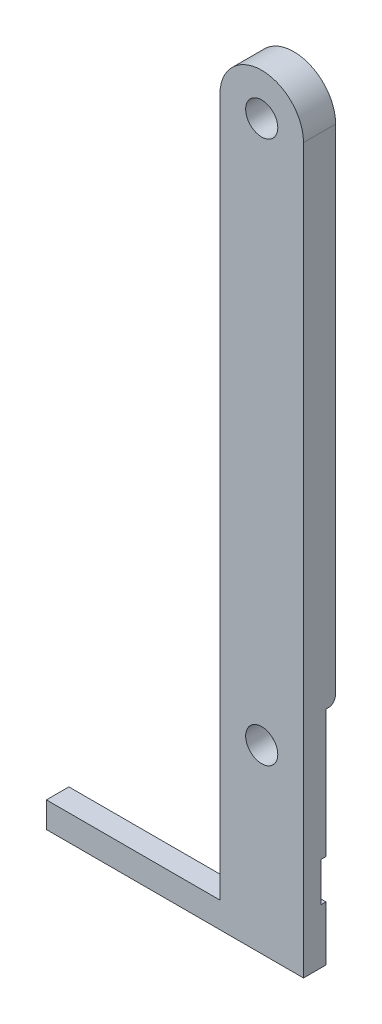
ISO-10303-21;
HEADER;
FILE_DESCRIPTION(('STEP AP214'),'2;1');
FILE_NAME('part.step','',(''),(''),'','','');
FILE_SCHEMA(('AUTOMOTIVE_DESIGN { 1 0 10303 214 1 1 1 1 }'));
ENDSEC;
DATA;
#1=APPLICATION_CONTEXT('core data for automotive mechanical design processes');
#2=APPLICATION_PROTOCOL_DEFINITION('international standard','automotive_design',2000,#1);
#3=PRODUCT_CONTEXT('',#1,'mechanical');
#4=PRODUCT('Part','Part','',(#3));
#5=PRODUCT_RELATED_PRODUCT_CATEGORY('part','',(#4));
#6=PRODUCT_DEFINITION_FORMATION('','',#4);
#7=PRODUCT_DEFINITION_CONTEXT('part definition',#1,'design');
#8=PRODUCT_DEFINITION('design','',#6,#7);
#9=PRODUCT_DEFINITION_SHAPE('','',#8);
#10=(LENGTH_UNIT() NAMED_UNIT(*) SI_UNIT(.MILLI.,.METRE.));
#11=(NAMED_UNIT(*) PLANE_ANGLE_UNIT() SI_UNIT($,.RADIAN.));
#12=(NAMED_UNIT(*) SI_UNIT($,.STERADIAN.) SOLID_ANGLE_UNIT());
#13=UNCERTAINTY_MEASURE_WITH_UNIT(LENGTH_MEASURE(1.E-05),#10,'distance_accuracy_value','');
#14=(GEOMETRIC_REPRESENTATION_CONTEXT(3) GLOBAL_UNCERTAINTY_ASSIGNED_CONTEXT((#13)) GLOBAL_UNIT_ASSIGNED_CONTEXT((#10,
#11,#12)) REPRESENTATION_CONTEXT('',''));
#15=CARTESIAN_POINT('',(0.,0.,0.));
#16=DIRECTION('',(0.,0.,1.));
#17=DIRECTION('',(1.,0.,0.));
#18=AXIS2_PLACEMENT_3D('',#15,#16,#17);
#19=CARTESIAN_POINT('',(0.,-24.12,5.));
#20=DIRECTION('',(0.,-1.,0.));
#21=DIRECTION('',(1.,0.,0.));
#22=AXIS2_PLACEMENT_3D('',#19,#20,#21);
#23=PLANE('',#22);
#24=DIRECTION('',(1.,0.,0.));
#25=VECTOR('',#24,1.);
#26=CARTESIAN_POINT('',(0.,-24.12,1.5));
#27=LINE('',#26,#25);
#28=CARTESIAN_POINT('',(-33.5,-24.12,1.5));
#29=VERTEX_POINT('',#28);
#30=CARTESIAN_POINT('',(-6.49999999999999,-24.12,1.5));
#31=VERTEX_POINT('',#30);
#32=EDGE_CURVE('E228',#29,#31,#27,.T.);
#33=ORIENTED_EDGE('',*,*,#32,.F.);
#34=DIRECTION('',(0.,0.,-1.));
#35=VECTOR('',#34,1.);
#36=CARTESIAN_POINT('',(-33.5,-24.12,5.));
#37=LINE('',#36,#35);
#38=CARTESIAN_POINT('',(-33.5,-24.12,5.));
#39=VERTEX_POINT('',#38);
#40=EDGE_CURVE('E283',#39,#29,#37,.T.);
#41=ORIENTED_EDGE('',*,*,#40,.F.);
#42=DIRECTION('',(-1.,0.,0.));
#43=VECTOR('',#42,1.);
#44=CARTESIAN_POINT('',(0.,-24.12,5.));
#45=LINE('',#44,#43);
#46=CARTESIAN_POINT('',(-6.49999999999999,-24.12,5.));
#47=VERTEX_POINT('',#46);
#48=EDGE_CURVE('E237',#47,#39,#45,.T.);
#49=ORIENTED_EDGE('',*,*,#48,.F.);
#50=DIRECTION('',(0.,0.,-1.));
#51=VECTOR('',#50,1.);
#52=CARTESIAN_POINT('',(-6.49999999999999,-24.12,5.));
#53=LINE('',#52,#51);
#54=EDGE_CURVE('E261',#47,#31,#53,.T.);
#55=ORIENTED_EDGE('',*,*,#54,.T.);
#56=EDGE_LOOP('',(#33,#41,#49,#55));
#57=FACE_BOUND('',#56,.T.);
#58=ADVANCED_FACE('F41',(#57),#23,.F.);
#59=CARTESIAN_POINT('',(-33.5,0.,5.));
#60=DIRECTION('',(1.,0.,0.));
#61=DIRECTION('',(0.,0.,-1.));
#62=AXIS2_PLACEMENT_3D('',#59,#60,#61);
#63=PLANE('',#62);
#64=DIRECTION('',(0.,1.,0.));
#65=VECTOR('',#64,1.);
#66=CARTESIAN_POINT('',(-33.5,0.,1.5));
#67=LINE('',#66,#65);
#68=CARTESIAN_POINT('',(-33.5,-28.12,1.5));
#69=VERTEX_POINT('',#68);
#70=EDGE_CURVE('E226',#69,#29,#67,.T.);
#71=ORIENTED_EDGE('',*,*,#70,.F.);
#72=DIRECTION('',(0.,0.,-1.));
#73=VECTOR('',#72,1.);
#74=CARTESIAN_POINT('',(-33.5,-28.12,5.));
#75=LINE('',#74,#73);
#76=CARTESIAN_POINT('',(-33.5,-28.12,5.));
#77=VERTEX_POINT('',#76);
#78=EDGE_CURVE('E280',#77,#69,#75,.T.);
#79=ORIENTED_EDGE('',*,*,#78,.F.);
#80=DIRECTION('',(0.,-1.,0.));
#81=VECTOR('',#80,1.);
#82=CARTESIAN_POINT('',(-33.5,0.,5.));
#83=LINE('',#82,#81);
#84=EDGE_CURVE('E240',#39,#77,#83,.T.);
#85=ORIENTED_EDGE('',*,*,#84,.F.);
#86=ORIENTED_EDGE('',*,*,#40,.T.);
#87=EDGE_LOOP('',(#71,#79,#85,#86));
#88=FACE_BOUND('',#87,.T.);
#89=ADVANCED_FACE('F305',(#88),#63,.F.);
#90=CARTESIAN_POINT('',(0.,-28.12,5.));
#91=DIRECTION('',(0.,-1.,0.));
#92=DIRECTION('',(0.,0.,-1.));
#93=AXIS2_PLACEMENT_3D('',#90,#91,#92);
#94=PLANE('',#93);
#95=ORIENTED_EDGE('',*,*,#78,.T.);
#96=DIRECTION('',(-1.,0.,0.));
#97=VECTOR('',#96,1.);
#98=CARTESIAN_POINT('',(0.,-28.12,1.5));
#99=LINE('',#98,#97);
#100=CARTESIAN_POINT('',(6.50000000000001,-28.12,1.5));
#101=VERTEX_POINT('',#100);
#102=EDGE_CURVE('E224',#101,#69,#99,.T.);
#103=ORIENTED_EDGE('',*,*,#102,.F.);
#104=DIRECTION('',(0.,0.,-1.));
#105=VECTOR('',#104,1.);
#106=CARTESIAN_POINT('',(6.50000000000001,-28.12,5.));
#107=LINE('',#106,#105);
#108=CARTESIAN_POINT('',(6.50000000000001,-28.12,5.));
#109=VERTEX_POINT('',#108);
#110=EDGE_CURVE('E277',#109,#101,#107,.T.);
#111=ORIENTED_EDGE('',*,*,#110,.F.);
#112=DIRECTION('',(-1.,0.,0.));
#113=VECTOR('',#112,1.);
#114=CARTESIAN_POINT('',(0.,-28.12,5.));
#115=LINE('',#114,#113);
#116=EDGE_CURVE('E243',#109,#77,#115,.T.);
#117=ORIENTED_EDGE('',*,*,#116,.T.);
#118=EDGE_LOOP('',(#95,#103,#111,#117));
#119=FACE_BOUND('',#118,.T.);
#120=ADVANCED_FACE('F302',(#119),#94,.T.);
#121=CARTESIAN_POINT('',(0.,0.,5.));
#122=DIRECTION('',(0.,0.,-1.));
#123=DIRECTION('',(-1.,0.,0.));
#124=AXIS2_PLACEMENT_3D('',#121,#122,#123);
#125=CYLINDRICAL_SURFACE('',#124,2.5);
#126=CARTESIAN_POINT('',(0.,0.,5.));
#127=DIRECTION('',(0.,0.,1.));
#128=DIRECTION('',(1.,0.,0.));
#129=AXIS2_PLACEMENT_3D('',#126,#127,#128);
#130=CIRCLE('',#129,2.5);
#131=CARTESIAN_POINT('',(2.50000000000001,0.,5.));
#132=VERTEX_POINT('',#131);
#133=EDGE_CURVE('E254',#132,#132,#130,.T.);
#134=ORIENTED_EDGE('',*,*,#133,.T.);
#135=EDGE_LOOP('',(#134));
#136=FACE_BOUND('',#135,.T.);
#137=CARTESIAN_POINT('',(0.,0.,1.5));
#138=DIRECTION('',(0.,0.,-1.));
#139=DIRECTION('',(-1.,0.,0.));
#140=AXIS2_PLACEMENT_3D('',#137,#138,#139);
#141=CIRCLE('',#140,2.5);
#142=CARTESIAN_POINT('',(-2.49999999999999,0.,1.5));
#143=VERTEX_POINT('',#142);
#144=EDGE_CURVE('E194',#143,#143,#141,.F.);
#145=ORIENTED_EDGE('',*,*,#144,.F.);
#146=EDGE_LOOP('',(#145));
#147=FACE_BOUND('',#146,.T.);
#148=ADVANCED_FACE('F301',(#136,#147),#125,.F.);
#149=CARTESIAN_POINT('',(6.50000000000001,0.,5.));
#150=DIRECTION('',(1.,0.,0.));
#151=DIRECTION('',(0.,1.,0.));
#152=AXIS2_PLACEMENT_3D('',#149,#150,#151);
#153=PLANE('',#152);
#154=DIRECTION('',(0.,0.,-1.));
#155=VECTOR('',#154,1.);
#156=CARTESIAN_POINT('',(6.50000000000001,6.36867333123626,1.5));
#157=LINE('',#156,#155);
#158=CARTESIAN_POINT('',(6.50000000000001,6.36867333123626,1.5));
#159=VERTEX_POINT('',#158);
#160=CARTESIAN_POINT('',(6.50000000000001,6.36867333123626,1.));
#161=VERTEX_POINT('',#160);
#162=EDGE_CURVE('E231',#159,#161,#157,.T.);
#163=ORIENTED_EDGE('',*,*,#162,.T.);
#164=CARTESIAN_POINT('',(6.50000000000001,6.36867333123626,1.));
#165=CARTESIAN_POINT('',(6.50000000000001,6.36866820237821,0.977485770303179));
#166=CARTESIAN_POINT('',(6.50000000000001,6.36976071423195,0.954985972087633));
#167=CARTESIAN_POINT('',(6.50000000000001,6.37408363522691,0.91021262475121));
#168=CARTESIAN_POINT('',(6.50000000000001,6.37731211087929,0.887938889493821));
#169=CARTESIAN_POINT('',(6.50000000000001,6.39003212132548,0.822138456041034));
#170=CARTESIAN_POINT('',(6.50000000000001,6.40256084251514,0.779169784210516));
#171=CARTESIAN_POINT('',(6.50000000000001,6.43466204370983,0.696190380620716));
#172=CARTESIAN_POINT('',(6.50000000000001,6.45421149166794,0.65617048659475));
#173=CARTESIAN_POINT('',(6.50000000000001,6.49914525862485,0.579469523882496));
#174=CARTESIAN_POINT('',(6.50000000000001,6.52454431350942,0.542797219598954));
#175=CARTESIAN_POINT('',(6.50000000000001,6.59220313531779,0.45780477912176));
#176=CARTESIAN_POINT('',(6.50000000000001,6.63696023016391,0.411474829333932));
#177=CARTESIAN_POINT('',(6.50000000000001,6.73328003540041,0.326550820519542));
#178=CARTESIAN_POINT('',(6.50000000000001,6.7848560627837,0.287972280906358));
#179=CARTESIAN_POINT('',(6.50000000000001,6.91146310029313,0.206263960610442));
#180=CARTESIAN_POINT('',(6.50000000000001,6.98844490488129,0.166160062876906));
#181=CARTESIAN_POINT('',(6.50000000000001,7.14783748096019,0.0988753340111897));
#182=CARTESIAN_POINT('',(6.50000000000001,7.23025356232351,0.0717073622536575));
#183=CARTESIAN_POINT('',(6.50000000000001,7.38238026527006,0.0339757639807743));
#184=CARTESIAN_POINT('',(6.50000000000001,7.45156546553959,0.0212503493596623));
#185=CARTESIAN_POINT('',(6.50000000000001,7.59065100826131,0.00429641915157164));
#186=CARTESIAN_POINT('',(6.50000000000001,7.66054668414649,2.962860249586E-05));
#187=CARTESIAN_POINT('',(6.50000000000001,7.73045923603508,0.));
#188=B_SPLINE_CURVE_WITH_KNOTS('',3,(#164,#165,#166,#167,#168,#169,#170,#171,#172,#173,#174,
#175,#176,#177,#178,#179,#180,#181,#182,#183,#184,#185,#186,#187),.UNSPECIFIED.,.F.,.F.,(4,2,2,
2,2,2,2,2,2,2,2,4),(0.,0.0674891147470087,0.134917221325395,0.26840751606408,0.401463826904855,
0.534859062110028,0.72704815602951,0.919618287130857,1.17866219132704,1.43796307161406,
1.64849931101882,1.85808068722376),.UNSPECIFIED.);
#189=CARTESIAN_POINT('',(6.50000000000001,7.73045923603508,0.));
#190=VERTEX_POINT('',#189);
#191=EDGE_CURVE('E73',#161,#190,#188,.T.);
#192=ORIENTED_EDGE('',*,*,#191,.T.);
#193=DIRECTION('',(0.,-1.,0.));
#194=VECTOR('',#193,1.);
#195=CARTESIAN_POINT('',(6.50000000000001,0.,0.));
#196=LINE('',#195,#194);
#197=CARTESIAN_POINT('',(6.50000000000002,84.43,0.));
#198=VERTEX_POINT('',#197);
#199=EDGE_CURVE('E233',#198,#190,#196,.T.);
#200=ORIENTED_EDGE('',*,*,#199,.F.);
#201=DIRECTION('',(0.,0.,-1.));
#202=VECTOR('',#201,1.);
#203=CARTESIAN_POINT('',(6.50000000000002,84.43,5.));
#204=LINE('',#203,#202);
#205=CARTESIAN_POINT('',(6.50000000000002,84.43,5.));
#206=VERTEX_POINT('',#205);
#207=EDGE_CURVE('E275',#206,#198,#204,.T.);
#208=ORIENTED_EDGE('',*,*,#207,.F.);
#209=DIRECTION('',(0.,-1.,0.));
#210=VECTOR('',#209,1.);
#211=CARTESIAN_POINT('',(6.50000000000001,0.,5.));
#212=LINE('',#211,#210);
#213=EDGE_CURVE('E246',#206,#109,#212,.T.);
#214=ORIENTED_EDGE('',*,*,#213,.T.);
#215=ORIENTED_EDGE('',*,*,#110,.T.);
#216=DIRECTION('',(0.,-1.,0.));
#217=VECTOR('',#216,1.);
#218=CARTESIAN_POINT('',(6.50000000000001,0.,1.5));
#219=LINE('',#218,#217);
#220=CARTESIAN_POINT('',(6.50000000000001,-19.61,1.5));
#221=VERTEX_POINT('',#220);
#222=EDGE_CURVE('E220',#221,#101,#219,.T.);
#223=ORIENTED_EDGE('',*,*,#222,.F.);
#224=DIRECTION('',(0.,0.,-1.));
#225=VECTOR('',#224,1.);
#226=CARTESIAN_POINT('',(6.50000000000001,-19.61,2.3));
#227=LINE('',#226,#225);
#228=CARTESIAN_POINT('',(6.50000000000001,-19.61,2.3));
#229=VERTEX_POINT('',#228);
#230=EDGE_CURVE('E195',#229,#221,#227,.T.);
#231=ORIENTED_EDGE('',*,*,#230,.F.);
#232=DIRECTION('',(0.,-1.,0.));
#233=VECTOR('',#232,1.);
#234=CARTESIAN_POINT('',(6.50000000000001,0.,2.3));
#235=LINE('',#234,#233);
#236=CARTESIAN_POINT('',(6.50000000000001,-13.51,2.3));
#237=VERTEX_POINT('',#236);
#238=EDGE_CURVE('E177',#237,#229,#235,.T.);
#239=ORIENTED_EDGE('',*,*,#238,.F.);
#240=DIRECTION('',(0.,0.,-1.));
#241=VECTOR('',#240,1.);
#242=CARTESIAN_POINT('',(6.50000000000001,-13.51,2.3));
#243=LINE('',#242,#241);
#244=CARTESIAN_POINT('',(6.50000000000001,-13.51,1.5));
#245=VERTEX_POINT('',#244);
#246=EDGE_CURVE('E168',#237,#245,#243,.T.);
#247=ORIENTED_EDGE('',*,*,#246,.T.);
#248=EDGE_CURVE('E221',#159,#245,#219,.T.);
#249=ORIENTED_EDGE('',*,*,#248,.F.);
#250=EDGE_LOOP('',(#163,#192,#200,#208,#214,#215,#223,#231,#239,#247,#249));
#251=FACE_BOUND('',#250,.T.);
#252=ADVANCED_FACE('F295',(#251),#153,.T.);
#253=CARTESIAN_POINT('',(0.,84.43,5.));
#254=DIRECTION('',(0.,0.,-1.));
#255=DIRECTION('',(-1.,0.,0.));
#256=AXIS2_PLACEMENT_3D('',#253,#254,#255);
#257=CYLINDRICAL_SURFACE('',#256,6.5);
#258=CARTESIAN_POINT('',(0.,84.43,0.));
#259=DIRECTION('',(0.,0.,1.));
#260=DIRECTION('',(1.,0.,0.));
#261=AXIS2_PLACEMENT_3D('',#258,#259,#260);
#262=CIRCLE('',#261,6.5);
#263=CARTESIAN_POINT('',(-6.49999999999999,84.43,0.));
#264=VERTEX_POINT('',#263);
#265=EDGE_CURVE('E263',#198,#264,#262,.T.);
#266=ORIENTED_EDGE('',*,*,#265,.T.);
#267=DIRECTION('',(0.,0.,-1.));
#268=VECTOR('',#267,1.);
#269=CARTESIAN_POINT('',(-6.49999999999999,84.43,5.));
#270=LINE('',#269,#268);
#271=CARTESIAN_POINT('',(-6.49999999999999,84.43,5.));
#272=VERTEX_POINT('',#271);
#273=EDGE_CURVE('E272',#272,#264,#270,.T.);
#274=ORIENTED_EDGE('',*,*,#273,.F.);
#275=CARTESIAN_POINT('',(0.,84.43,5.));
#276=DIRECTION('',(0.,0.,1.));
#277=DIRECTION('',(1.,0.,0.));
#278=AXIS2_PLACEMENT_3D('',#275,#276,#277);
#279=CIRCLE('',#278,6.5);
#280=EDGE_CURVE('E249',#206,#272,#279,.T.);
#281=ORIENTED_EDGE('',*,*,#280,.F.);
#282=ORIENTED_EDGE('',*,*,#207,.T.);
#283=EDGE_LOOP('',(#266,#274,#281,#282));
#284=FACE_BOUND('',#283,.T.);
#285=ADVANCED_FACE('F300',(#284),#257,.T.);
#286=CARTESIAN_POINT('',(-6.49999999999999,0.,5.));
#287=DIRECTION('',(1.,0.,0.));
#288=DIRECTION('',(0.,1.,0.));
#289=AXIS2_PLACEMENT_3D('',#286,#287,#288);
#290=PLANE('',#289);
#291=DIRECTION('',(0.,-1.,0.));
#292=VECTOR('',#291,1.);
#293=CARTESIAN_POINT('',(-6.49999999999999,0.,0.));
#294=LINE('',#293,#292);
#295=CARTESIAN_POINT('',(-6.49999999999999,7.73045923603508,0.));
#296=VERTEX_POINT('',#295);
#297=EDGE_CURVE('E265',#264,#296,#294,.T.);
#298=ORIENTED_EDGE('',*,*,#297,.T.);
#299=CARTESIAN_POINT('',(-6.49999999999999,7.73045923603508,0.));
#300=CARTESIAN_POINT('',(-6.49999999999999,7.68841108720236,4.89197177850845E-06));
#301=CARTESIAN_POINT('',(-6.49999999999999,7.64638002589235,0.00155375181801104));
#302=CARTESIAN_POINT('',(-6.49999999999999,7.56254100373806,0.00770476620955288));
#303=CARTESIAN_POINT('',(-6.49999999999999,7.5207330463868,0.0123069684186861));
#304=CARTESIAN_POINT('',(-6.49999999999999,7.39506342378203,0.0307687408217459));
#305=CARTESIAN_POINT('',(-6.49999999999999,7.31183907855206,0.049282585772636));
#306=CARTESIAN_POINT('',(-6.49999999999999,7.13703188289832,0.102241890412782));
#307=CARTESIAN_POINT('',(-6.49999999999999,7.04603557868287,0.13864012482835));
#308=CARTESIAN_POINT('',(-6.49999999999999,6.87286064417869,0.228139463694193));
#309=CARTESIAN_POINT('',(-6.49999999999999,6.79064138792755,0.28115870153319));
#310=CARTESIAN_POINT('',(-6.49999999999999,6.67355964380147,0.377691068655086));
#311=CARTESIAN_POINT('',(-6.49999999999999,6.63372222562028,0.415205345047863));
#312=CARTESIAN_POINT('',(-6.49999999999999,6.56021262020435,0.495889721803572));
#313=CARTESIAN_POINT('',(-6.49999999999999,6.52653243148407,0.539052354926632));
#314=CARTESIAN_POINT('',(-6.49999999999999,6.4727722862949,0.622341301560378));
#315=CARTESIAN_POINT('',(-6.49999999999999,6.45133220606839,0.661585688539413));
#316=CARTESIAN_POINT('',(-6.49999999999999,6.41523690262441,0.743050465484703));
#317=CARTESIAN_POINT('',(-6.49999999999999,6.40056656093085,0.785263979109133));
#318=CARTESIAN_POINT('',(-6.49999999999999,6.38288435332132,0.856439466267798));
#319=CARTESIAN_POINT('',(-6.49999999999999,6.37758724145912,0.884845665806041));
#320=CARTESIAN_POINT('',(-6.49999999999999,6.37046783718241,0.942158395066292));
#321=CARTESIAN_POINT('',(-6.49999999999999,6.36865406784237,0.971065977815371));
#322=CARTESIAN_POINT('',(-6.49999999999999,6.36867333123626,0.999999999999999));
#323=B_SPLINE_CURVE_WITH_KNOTS('',3,(#299,#300,#301,#302,#303,#304,#305,#306,#307,#308,#309,
#310,#311,#312,#313,#314,#315,#316,#317,#318,#319,#320,#321,#322),.UNSPECIFIED.,.F.,.F.,(4,2,2,
2,2,2,2,2,2,2,2,4),(0.,0.126083405385702,0.252168779027143,0.506963525585729,0.799478207696993,
1.09057416763202,1.25424021235184,1.4176920328308,1.55133357518331,1.68467520155345,
1.77116254792582,1.85786124405855),.UNSPECIFIED.);
#324=CARTESIAN_POINT('',(-6.49999999999999,6.36867333123626,1.));
#325=VERTEX_POINT('',#324);
#326=EDGE_CURVE('E11',#296,#325,#323,.T.);
#327=ORIENTED_EDGE('',*,*,#326,.T.);
#328=DIRECTION('',(0.,0.,-1.));
#329=VECTOR('',#328,1.);
#330=CARTESIAN_POINT('',(-6.49999999999999,6.36867333123626,1.5));
#331=LINE('',#330,#329);
#332=CARTESIAN_POINT('',(-6.49999999999999,6.36867333123626,1.5));
#333=VERTEX_POINT('',#332);
#334=EDGE_CURVE('E230',#333,#325,#331,.T.);
#335=ORIENTED_EDGE('',*,*,#334,.F.);
#336=DIRECTION('',(0.,1.,0.));
#337=VECTOR('',#336,1.);
#338=CARTESIAN_POINT('',(-6.49999999999999,0.,1.5));
#339=LINE('',#338,#337);
#340=CARTESIAN_POINT('',(-6.49999999999999,-15.7300389275978,1.5));
#341=VERTEX_POINT('',#340);
#342=EDGE_CURVE('E212',#341,#333,#339,.T.);
#343=ORIENTED_EDGE('',*,*,#342,.F.);
#344=DIRECTION('',(0.,0.,-1.));
#345=VECTOR('',#344,1.);
#346=CARTESIAN_POINT('',(-6.49999999999999,-15.7300389275978,2.3));
#347=LINE('',#346,#345);
#348=CARTESIAN_POINT('',(-6.49999999999999,-15.7300389275978,2.3));
#349=VERTEX_POINT('',#348);
#350=EDGE_CURVE('E204',#349,#341,#347,.T.);
#351=ORIENTED_EDGE('',*,*,#350,.F.);
#352=DIRECTION('',(0.,1.,0.));
#353=VECTOR('',#352,1.);
#354=CARTESIAN_POINT('',(-6.49999999999999,0.,2.3));
#355=LINE('',#354,#353);
#356=CARTESIAN_POINT('',(-6.49999999999999,-21.5099610724022,2.3));
#357=VERTEX_POINT('',#356);
#358=EDGE_CURVE('E198',#357,#349,#355,.T.);
#359=ORIENTED_EDGE('',*,*,#358,.F.);
#360=DIRECTION('',(0.,0.,-1.));
#361=VECTOR('',#360,1.);
#362=CARTESIAN_POINT('',(-6.49999999999999,-21.5099610724022,2.3));
#363=LINE('',#362,#361);
#364=CARTESIAN_POINT('',(-6.49999999999999,-21.5099610724022,1.5));
#365=VERTEX_POINT('',#364);
#366=EDGE_CURVE('E190',#357,#365,#363,.T.);
#367=ORIENTED_EDGE('',*,*,#366,.T.);
#368=EDGE_CURVE('E213',#31,#365,#339,.T.);
#369=ORIENTED_EDGE('',*,*,#368,.F.);
#370=ORIENTED_EDGE('',*,*,#54,.F.);
#371=DIRECTION('',(0.,-1.,0.));
#372=VECTOR('',#371,1.);
#373=CARTESIAN_POINT('',(-6.49999999999999,0.,5.));
#374=LINE('',#373,#372);
#375=EDGE_CURVE('E251',#272,#47,#374,.T.);
#376=ORIENTED_EDGE('',*,*,#375,.F.);
#377=ORIENTED_EDGE('',*,*,#273,.T.);
#378=EDGE_LOOP('',(#298,#327,#335,#343,#351,#359,#367,#369,#370,#376,#377));
#379=FACE_BOUND('',#378,.T.);
#380=ADVANCED_FACE('F330',(#379),#290,.F.);
#381=CARTESIAN_POINT('',(0.,84.43,5.));
#382=DIRECTION('',(0.,0.,-1.));
#383=DIRECTION('',(-1.,0.,0.));
#384=AXIS2_PLACEMENT_3D('',#381,#382,#383);
#385=CYLINDRICAL_SURFACE('',#384,2.5);
#386=CARTESIAN_POINT('',(0.,84.43,5.));
#387=DIRECTION('',(0.,0.,1.));
#388=DIRECTION('',(1.,0.,0.));
#389=AXIS2_PLACEMENT_3D('',#386,#387,#388);
#390=CIRCLE('',#389,2.5);
#391=CARTESIAN_POINT('',(2.50000000000002,84.43,5.));
#392=VERTEX_POINT('',#391);
#393=EDGE_CURVE('E258',#392,#392,#390,.T.);
#394=ORIENTED_EDGE('',*,*,#393,.T.);
#395=EDGE_LOOP('',(#394));
#396=FACE_BOUND('',#395,.T.);
#397=CARTESIAN_POINT('',(0.,84.43,0.));
#398=DIRECTION('',(0.,0.,1.));
#399=DIRECTION('',(1.,0.,0.));
#400=AXIS2_PLACEMENT_3D('',#397,#398,#399);
#401=CIRCLE('',#400,2.5);
#402=CARTESIAN_POINT('',(2.50000000000002,84.43,0.));
#403=VERTEX_POINT('',#402);
#404=EDGE_CURVE('E241',#403,#403,#401,.T.);
#405=ORIENTED_EDGE('',*,*,#404,.F.);
#406=EDGE_LOOP('',(#405));
#407=FACE_BOUND('',#406,.T.);
#408=ADVANCED_FACE('F378',(#396,#407),#385,.F.);
#409=CARTESIAN_POINT('',(0.,0.,5.));
#410=DIRECTION('',(0.,0.,1.));
#411=DIRECTION('',(1.,0.,0.));
#412=AXIS2_PLACEMENT_3D('',#409,#410,#411);
#413=PLANE('',#412);
#414=ORIENTED_EDGE('',*,*,#48,.T.);
#415=ORIENTED_EDGE('',*,*,#84,.T.);
#416=ORIENTED_EDGE('',*,*,#116,.F.);
#417=ORIENTED_EDGE('',*,*,#213,.F.);
#418=ORIENTED_EDGE('',*,*,#280,.T.);
#419=ORIENTED_EDGE('',*,*,#375,.T.);
#420=EDGE_LOOP('',(#414,#415,#416,#417,#418,#419));
#421=FACE_BOUND('',#420,.T.);
#422=ORIENTED_EDGE('',*,*,#133,.F.);
#423=EDGE_LOOP('',(#422));
#424=FACE_BOUND('',#423,.T.);
#425=ORIENTED_EDGE('',*,*,#393,.F.);
#426=EDGE_LOOP('',(#425));
#427=FACE_BOUND('',#426,.T.);
#428=ADVANCED_FACE('F323',(#421,#424,#427),#413,.T.);
#429=CARTESIAN_POINT('',(0.,0.,0.));
#430=DIRECTION('',(0.,0.,1.));
#431=DIRECTION('',(1.,0.,0.));
#432=AXIS2_PLACEMENT_3D('',#429,#430,#431);
#433=PLANE('',#432);
#434=ORIENTED_EDGE('',*,*,#199,.T.);
#435=CARTESIAN_POINT('',(0.,0.,0.));
#436=DIRECTION('',(0.,0.,1.));
#437=DIRECTION('',(1.,0.,0.));
#438=AXIS2_PLACEMENT_3D('',#435,#436,#437);
#439=CIRCLE('',#438,10.1);
#440=EDGE_CURVE('E56',#190,#296,#439,.T.);
#441=ORIENTED_EDGE('',*,*,#440,.T.);
#442=ORIENTED_EDGE('',*,*,#297,.F.);
#443=ORIENTED_EDGE('',*,*,#265,.F.);
#444=EDGE_LOOP('',(#434,#441,#442,#443));
#445=FACE_BOUND('',#444,.T.);
#446=ORIENTED_EDGE('',*,*,#404,.T.);
#447=EDGE_LOOP('',(#446));
#448=FACE_BOUND('',#447,.T.);
#449=ADVANCED_FACE('F375',(#445,#448),#433,.F.);
#450=CARTESIAN_POINT('',(0.,0.,1.5));
#451=DIRECTION('',(0.,0.,-1.));
#452=DIRECTION('',(-1.,0.,0.));
#453=AXIS2_PLACEMENT_3D('',#450,#451,#452);
#454=CYLINDRICAL_SURFACE('',#453,9.1);
#455=ORIENTED_EDGE('',*,*,#334,.T.);
#456=CARTESIAN_POINT('',(0.,0.,1.));
#457=DIRECTION('',(0.,0.,1.));
#458=DIRECTION('',(1.,0.,0.));
#459=AXIS2_PLACEMENT_3D('',#456,#457,#458);
#460=CIRCLE('',#459,9.1);
#461=EDGE_CURVE('E286',#325,#161,#460,.F.);
#462=ORIENTED_EDGE('',*,*,#461,.T.);
#463=ORIENTED_EDGE('',*,*,#162,.F.);
#464=CARTESIAN_POINT('',(0.,0.,1.5));
#465=DIRECTION('',(0.,0.,-1.));
#466=DIRECTION('',(-1.,0.,0.));
#467=AXIS2_PLACEMENT_3D('',#464,#465,#466);
#468=CIRCLE('',#467,9.1);
#469=EDGE_CURVE('E216',#333,#159,#468,.T.);
#470=ORIENTED_EDGE('',*,*,#469,.F.);
#471=EDGE_LOOP('',(#455,#462,#463,#470));
#472=FACE_BOUND('',#471,.T.);
#473=ADVANCED_FACE('F346',(#472),#454,.F.);
#474=CARTESIAN_POINT('',(0.,0.,1.5));
#475=DIRECTION('',(0.,0.,-1.));
#476=DIRECTION('',(-1.,0.,0.));
#477=AXIS2_PLACEMENT_3D('',#474,#475,#476);
#478=PLANE('',#477);
#479=DIRECTION('',(-1.,0.,0.));
#480=VECTOR('',#479,1.);
#481=CARTESIAN_POINT('',(0.,-19.61,1.5));
#482=LINE('',#481,#480);
#483=CARTESIAN_POINT('',(3.47499999999999,-19.61,1.5));
#484=VERTEX_POINT('',#483);
#485=EDGE_CURVE('E181',#221,#484,#482,.T.);
#486=ORIENTED_EDGE('',*,*,#485,.F.);
#487=ORIENTED_EDGE('',*,*,#222,.T.);
#488=ORIENTED_EDGE('',*,*,#102,.T.);
#489=ORIENTED_EDGE('',*,*,#70,.T.);
#490=ORIENTED_EDGE('',*,*,#32,.T.);
#491=ORIENTED_EDGE('',*,*,#368,.T.);
#492=CARTESIAN_POINT('',(-5.52500000000001,-18.62,1.5));
#493=DIRECTION('',(0.,0.,-1.));
#494=DIRECTION('',(-1.,0.,0.));
#495=AXIS2_PLACEMENT_3D('',#492,#493,#494);
#496=CIRCLE('',#495,3.05);
#497=EDGE_CURVE('E201',#341,#365,#496,.T.);
#498=ORIENTED_EDGE('',*,*,#497,.F.);
#499=ORIENTED_EDGE('',*,*,#342,.T.);
#500=ORIENTED_EDGE('',*,*,#469,.T.);
#501=ORIENTED_EDGE('',*,*,#248,.T.);
#502=DIRECTION('',(1.,0.,0.));
#503=VECTOR('',#502,1.);
#504=CARTESIAN_POINT('',(0.,-13.51,1.5));
#505=LINE('',#504,#503);
#506=CARTESIAN_POINT('',(3.47499999999999,-13.51,1.5));
#507=VERTEX_POINT('',#506);
#508=EDGE_CURVE('E184',#507,#245,#505,.T.);
#509=ORIENTED_EDGE('',*,*,#508,.F.);
#510=CARTESIAN_POINT('',(3.47499999999999,-16.56,1.5));
#511=DIRECTION('',(0.,0.,-1.));
#512=DIRECTION('',(-1.,0.,0.));
#513=AXIS2_PLACEMENT_3D('',#510,#511,#512);
#514=CIRCLE('',#513,3.05);
#515=EDGE_CURVE('E165',#484,#507,#514,.T.);
#516=ORIENTED_EDGE('',*,*,#515,.F.);
#517=EDGE_LOOP('',(#486,#487,#488,#489,#490,#491,#498,#499,#500,#501,#509,#516));
#518=FACE_BOUND('',#517,.T.);
#519=ORIENTED_EDGE('',*,*,#144,.T.);
#520=EDGE_LOOP('',(#519));
#521=FACE_BOUND('',#520,.T.);
#522=ADVANCED_FACE('F334',(#518,#521),#478,.T.);
#523=CARTESIAN_POINT('',(-5.52500000000001,-18.62,2.3));
#524=DIRECTION('',(0.,0.,-1.));
#525=DIRECTION('',(-1.,0.,0.));
#526=AXIS2_PLACEMENT_3D('',#523,#524,#525);
#527=CYLINDRICAL_SURFACE('',#526,3.05);
#528=ORIENTED_EDGE('',*,*,#497,.T.);
#529=ORIENTED_EDGE('',*,*,#366,.F.);
#530=CARTESIAN_POINT('',(-5.52500000000001,-18.62,2.3));
#531=DIRECTION('',(0.,0.,-1.));
#532=DIRECTION('',(-1.,0.,0.));
#533=AXIS2_PLACEMENT_3D('',#530,#531,#532);
#534=CIRCLE('',#533,3.05);
#535=EDGE_CURVE('E200',#349,#357,#534,.T.);
#536=ORIENTED_EDGE('',*,*,#535,.F.);
#537=ORIENTED_EDGE('',*,*,#350,.T.);
#538=EDGE_LOOP('',(#528,#529,#536,#537));
#539=FACE_BOUND('',#538,.T.);
#540=ADVANCED_FACE('F367',(#539),#527,.F.);
#541=CARTESIAN_POINT('',(0.,0.,2.3));
#542=DIRECTION('',(0.,0.,-1.));
#543=DIRECTION('',(-1.,0.,0.));
#544=AXIS2_PLACEMENT_3D('',#541,#542,#543);
#545=PLANE('',#544);
#546=ORIENTED_EDGE('',*,*,#358,.T.);
#547=ORIENTED_EDGE('',*,*,#535,.T.);
#548=EDGE_LOOP('',(#546,#547));
#549=FACE_BOUND('',#548,.T.);
#550=ADVANCED_FACE('F364',(#549),#545,.T.);
#551=CARTESIAN_POINT('',(3.47499999999999,-16.56,2.3));
#552=DIRECTION('',(0.,0.,-1.));
#553=DIRECTION('',(-1.,0.,0.));
#554=AXIS2_PLACEMENT_3D('',#551,#552,#553);
#555=CYLINDRICAL_SURFACE('',#554,3.05);
#556=ORIENTED_EDGE('',*,*,#515,.T.);
#557=DIRECTION('',(0.,0.,-1.));
#558=VECTOR('',#557,1.);
#559=CARTESIAN_POINT('',(3.47499999999999,-13.51,2.3));
#560=LINE('',#559,#558);
#561=CARTESIAN_POINT('',(3.47499999999999,-13.51,2.3));
#562=VERTEX_POINT('',#561);
#563=EDGE_CURVE('E158',#562,#507,#560,.T.);
#564=ORIENTED_EDGE('',*,*,#563,.F.);
#565=CARTESIAN_POINT('',(3.47499999999999,-16.56,2.3));
#566=DIRECTION('',(0.,0.,-1.));
#567=DIRECTION('',(-1.,0.,0.));
#568=AXIS2_PLACEMENT_3D('',#565,#566,#567);
#569=CIRCLE('',#568,3.05);
#570=CARTESIAN_POINT('',(3.47499999999999,-19.61,2.3));
#571=VERTEX_POINT('',#570);
#572=EDGE_CURVE('E162',#571,#562,#569,.T.);
#573=ORIENTED_EDGE('',*,*,#572,.F.);
#574=DIRECTION('',(0.,0.,-1.));
#575=VECTOR('',#574,1.);
#576=CARTESIAN_POINT('',(3.47499999999999,-19.61,2.3));
#577=LINE('',#576,#575);
#578=EDGE_CURVE('E192',#571,#484,#577,.T.);
#579=ORIENTED_EDGE('',*,*,#578,.T.);
#580=EDGE_LOOP('',(#556,#564,#573,#579));
#581=FACE_BOUND('',#580,.T.);
#582=ADVANCED_FACE('F160',(#581),#555,.F.);
#583=CARTESIAN_POINT('',(0.,-19.61,2.3));
#584=DIRECTION('',(0.,-1.,0.));
#585=DIRECTION('',(0.,0.,-1.));
#586=AXIS2_PLACEMENT_3D('',#583,#584,#585);
#587=PLANE('',#586);
#588=ORIENTED_EDGE('',*,*,#485,.T.);
#589=ORIENTED_EDGE('',*,*,#578,.F.);
#590=DIRECTION('',(-1.,0.,0.));
#591=VECTOR('',#590,1.);
#592=CARTESIAN_POINT('',(0.,-19.61,2.3));
#593=LINE('',#592,#591);
#594=EDGE_CURVE('E169',#229,#571,#593,.T.);
#595=ORIENTED_EDGE('',*,*,#594,.F.);
#596=ORIENTED_EDGE('',*,*,#230,.T.);
#597=EDGE_LOOP('',(#588,#589,#595,#596));
#598=FACE_BOUND('',#597,.T.);
#599=ADVANCED_FACE('F356',(#598),#587,.F.);
#600=CARTESIAN_POINT('',(0.,-13.51,2.3));
#601=DIRECTION('',(0.,1.,0.));
#602=DIRECTION('',(0.,0.,1.));
#603=AXIS2_PLACEMENT_3D('',#600,#601,#602);
#604=PLANE('',#603);
#605=ORIENTED_EDGE('',*,*,#508,.T.);
#606=ORIENTED_EDGE('',*,*,#246,.F.);
#607=DIRECTION('',(1.,0.,0.));
#608=VECTOR('',#607,1.);
#609=CARTESIAN_POINT('',(0.,-13.51,2.3));
#610=LINE('',#609,#608);
#611=EDGE_CURVE('E172',#562,#237,#610,.T.);
#612=ORIENTED_EDGE('',*,*,#611,.F.);
#613=ORIENTED_EDGE('',*,*,#563,.T.);
#614=EDGE_LOOP('',(#605,#606,#612,#613));
#615=FACE_BOUND('',#614,.T.);
#616=ADVANCED_FACE('F173',(#615),#604,.F.);
#617=CARTESIAN_POINT('',(0.,0.,2.3));
#618=DIRECTION('',(0.,0.,-1.));
#619=DIRECTION('',(-1.,0.,0.));
#620=AXIS2_PLACEMENT_3D('',#617,#618,#619);
#621=PLANE('',#620);
#622=ORIENTED_EDGE('',*,*,#572,.T.);
#623=ORIENTED_EDGE('',*,*,#611,.T.);
#624=ORIENTED_EDGE('',*,*,#238,.T.);
#625=ORIENTED_EDGE('',*,*,#594,.T.);
#626=EDGE_LOOP('',(#622,#623,#624,#625));
#627=FACE_BOUND('',#626,.T.);
#628=ADVANCED_FACE('F179',(#627),#621,.T.);
#629=CARTESIAN_POINT('',(0.,0.,1.));
#630=DIRECTION('',(0.,0.,1.));
#631=DIRECTION('',(1.,0.,0.));
#632=AXIS2_PLACEMENT_3D('',#629,#630,#631);
#633=TOROIDAL_SURFACE('',#632,10.1,1.);
#634=ORIENTED_EDGE('',*,*,#326,.F.);
#635=ORIENTED_EDGE('',*,*,#440,.F.);
#636=ORIENTED_EDGE('',*,*,#191,.F.);
#637=ORIENTED_EDGE('',*,*,#461,.F.);
#638=EDGE_LOOP('',(#634,#635,#636,#637));
#639=FACE_BOUND('',#638,.T.);
#640=ADVANCED_FACE('F43',(#639),#633,.T.);
#641=CLOSED_SHELL('',(#58,#89,#120,#148,#252,#285,#380,#408,#428,#449,#473,#522,#540,#550,#582,
#599,#616,#628,#640));
#642=MANIFOLD_SOLID_BREP('B2',#641);
#643=ADVANCED_BREP_SHAPE_REPRESENTATION('',(#18,#642),#14);
#644=SHAPE_DEFINITION_REPRESENTATION(#9,#643);
ENDSEC;
END-ISO-10303-21;
